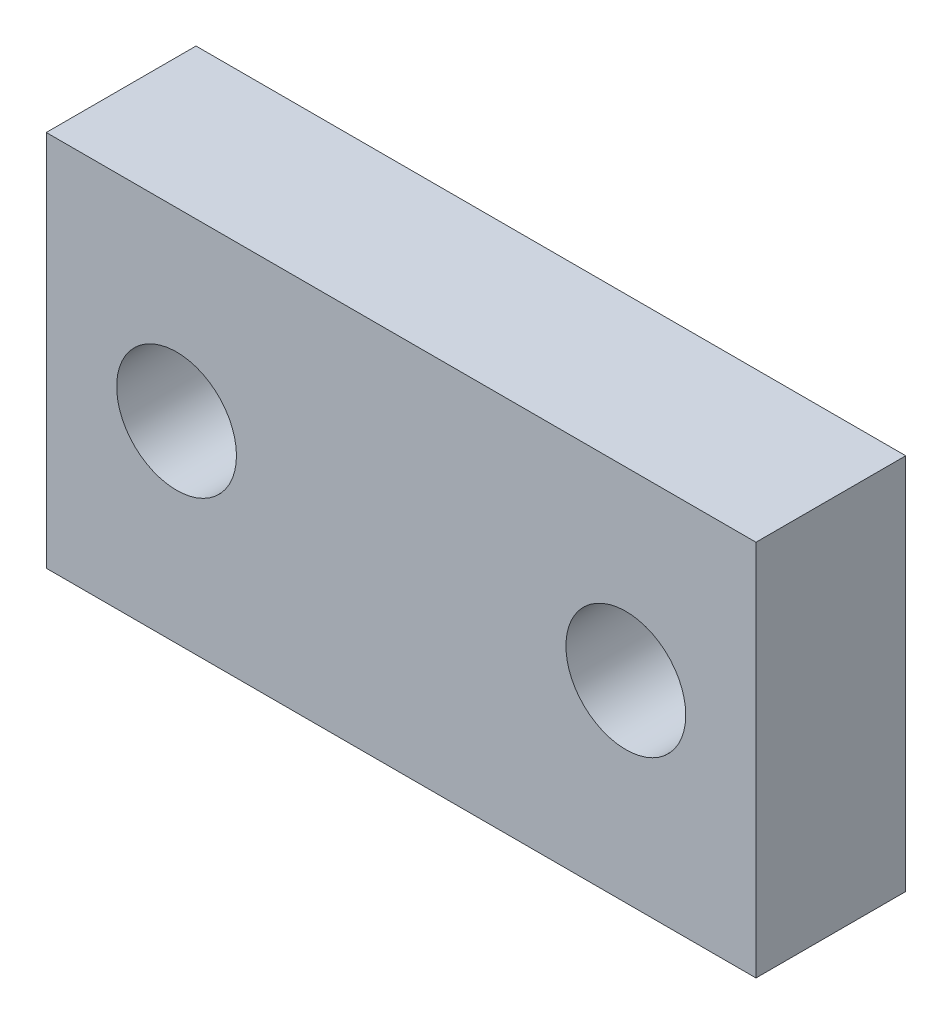
ISO-10303-21;
HEADER;
FILE_DESCRIPTION(('STEP AP214'),'2;1');
FILE_NAME('part.step','',(''),(''),'','','');
FILE_SCHEMA(('AUTOMOTIVE_DESIGN { 1 0 10303 214 1 1 1 1 }'));
ENDSEC;
DATA;
#1=APPLICATION_CONTEXT('core data for automotive mechanical design processes');
#2=APPLICATION_PROTOCOL_DEFINITION('international standard','automotive_design',2000,#1);
#3=PRODUCT_CONTEXT('',#1,'mechanical');
#4=PRODUCT('Part','Part','',(#3));
#5=PRODUCT_RELATED_PRODUCT_CATEGORY('part','',(#4));
#6=PRODUCT_DEFINITION_FORMATION('','',#4);
#7=PRODUCT_DEFINITION_CONTEXT('part definition',#1,'design');
#8=PRODUCT_DEFINITION('design','',#6,#7);
#9=PRODUCT_DEFINITION_SHAPE('','',#8);
#10=(LENGTH_UNIT() NAMED_UNIT(*) SI_UNIT(.MILLI.,.METRE.));
#11=(NAMED_UNIT(*) PLANE_ANGLE_UNIT() SI_UNIT($,.RADIAN.));
#12=(NAMED_UNIT(*) SI_UNIT($,.STERADIAN.) SOLID_ANGLE_UNIT());
#13=UNCERTAINTY_MEASURE_WITH_UNIT(LENGTH_MEASURE(1.E-05),#10,'distance_accuracy_value','');
#14=(GEOMETRIC_REPRESENTATION_CONTEXT(3) GLOBAL_UNCERTAINTY_ASSIGNED_CONTEXT((#13)) GLOBAL_UNIT_ASSIGNED_CONTEXT((#10,
#11,#12)) REPRESENTATION_CONTEXT('',''));
#15=CARTESIAN_POINT('',(0.,0.,0.));
#16=DIRECTION('',(0.,0.,1.));
#17=DIRECTION('',(1.,0.,0.));
#18=AXIS2_PLACEMENT_3D('',#15,#16,#17);
#19=CARTESIAN_POINT('',(0.,0.,5.));
#20=DIRECTION('',(0.,0.,-1.));
#21=DIRECTION('',(-1.,0.,0.));
#22=AXIS2_PLACEMENT_3D('',#19,#20,#21);
#23=PLANE('',#22);
#24=DIRECTION('',(1.,0.,0.));
#25=VECTOR('',#24,1.);
#26=CARTESIAN_POINT('',(-17.839729087058,5.99595443833464,5.));
#27=LINE('',#26,#25);
#28=CARTESIAN_POINT('',(-17.839729087058,5.99595443833464,5.));
#29=VERTEX_POINT('',#28);
#30=CARTESIAN_POINT('',(5.85553092793795,5.99595443833464,5.));
#31=VERTEX_POINT('',#30);
#32=EDGE_CURVE('E85',#29,#31,#27,.T.);
#33=ORIENTED_EDGE('',*,*,#32,.T.);
#34=DIRECTION('',(0.,1.,0.));
#35=VECTOR('',#34,1.);
#36=CARTESIAN_POINT('',(5.85553092793795,18.5959544383347,5.));
#37=LINE('',#36,#35);
#38=CARTESIAN_POINT('',(5.85553092793795,18.5959544383347,5.));
#39=VERTEX_POINT('',#38);
#40=EDGE_CURVE('E80',#31,#39,#37,.T.);
#41=ORIENTED_EDGE('',*,*,#40,.T.);
#42=DIRECTION('',(-1.,0.,0.));
#43=VECTOR('',#42,1.);
#44=CARTESIAN_POINT('',(-17.839729087058,18.5959544383347,5.));
#45=LINE('',#44,#43);
#46=CARTESIAN_POINT('',(-17.839729087058,18.5959544383347,5.));
#47=VERTEX_POINT('',#46);
#48=EDGE_CURVE('E83',#39,#47,#45,.T.);
#49=ORIENTED_EDGE('',*,*,#48,.T.);
#50=DIRECTION('',(0.,-1.,0.));
#51=VECTOR('',#50,1.);
#52=CARTESIAN_POINT('',(-17.839729087058,18.5959544383347,5.));
#53=LINE('',#52,#51);
#54=EDGE_CURVE('E50',#47,#29,#53,.T.);
#55=ORIENTED_EDGE('',*,*,#54,.T.);
#56=EDGE_LOOP('',(#33,#41,#49,#55));
#57=FACE_BOUND('',#56,.T.);
#58=CARTESIAN_POINT('',(-13.489729087058,12.4259851153314,5.));
#59=DIRECTION('',(0.,0.,1.));
#60=DIRECTION('',(1.,0.,0.));
#61=AXIS2_PLACEMENT_3D('',#58,#59,#60);
#62=CIRCLE('',#61,2.);
#63=CARTESIAN_POINT('',(-11.4897290870579,12.4259851153314,5.));
#64=VERTEX_POINT('',#63);
#65=EDGE_CURVE('E100',#64,#64,#62,.T.);
#66=ORIENTED_EDGE('',*,*,#65,.F.);
#67=EDGE_LOOP('',(#66));
#68=FACE_BOUND('',#67,.T.);
#69=CARTESIAN_POINT('',(1.51027091294206,12.4259851153314,5.));
#70=DIRECTION('',(0.,0.,1.));
#71=DIRECTION('',(1.,0.,0.));
#72=AXIS2_PLACEMENT_3D('',#69,#70,#71);
#73=CIRCLE('',#72,2.);
#74=CARTESIAN_POINT('',(3.51027091294206,12.4259851153314,5.));
#75=VERTEX_POINT('',#74);
#76=EDGE_CURVE('E115',#75,#75,#73,.T.);
#77=ORIENTED_EDGE('',*,*,#76,.F.);
#78=EDGE_LOOP('',(#77));
#79=FACE_BOUND('',#78,.T.);
#80=ADVANCED_FACE('F33',(#57,#68,#79),#23,.F.);
#81=CARTESIAN_POINT('',(0.,0.,0.));
#82=DIRECTION('',(0.,0.,-1.));
#83=DIRECTION('',(-1.,0.,0.));
#84=AXIS2_PLACEMENT_3D('',#81,#82,#83);
#85=PLANE('',#84);
#86=CARTESIAN_POINT('',(-13.489729087058,12.4259851153314,0.));
#87=DIRECTION('',(0.,0.,1.));
#88=DIRECTION('',(1.,0.,0.));
#89=AXIS2_PLACEMENT_3D('',#86,#87,#88);
#90=CIRCLE('',#89,2.);
#91=CARTESIAN_POINT('',(-11.4897290870579,12.4259851153314,0.));
#92=VERTEX_POINT('',#91);
#93=EDGE_CURVE('E112',#92,#92,#90,.T.);
#94=ORIENTED_EDGE('',*,*,#93,.T.);
#95=EDGE_LOOP('',(#94));
#96=FACE_BOUND('',#95,.T.);
#97=DIRECTION('',(1.,0.,0.));
#98=VECTOR('',#97,1.);
#99=CARTESIAN_POINT('',(-17.839729087058,5.99595443833464,0.));
#100=LINE('',#99,#98);
#101=CARTESIAN_POINT('',(-17.839729087058,5.99595443833464,0.));
#102=VERTEX_POINT('',#101);
#103=CARTESIAN_POINT('',(5.85553092793795,5.99595443833464,0.));
#104=VERTEX_POINT('',#103);
#105=EDGE_CURVE('E97',#102,#104,#100,.T.);
#106=ORIENTED_EDGE('',*,*,#105,.F.);
#107=DIRECTION('',(0.,-1.,0.));
#108=VECTOR('',#107,1.);
#109=CARTESIAN_POINT('',(-17.839729087058,18.5959544383347,0.));
#110=LINE('',#109,#108);
#111=CARTESIAN_POINT('',(-17.839729087058,18.5959544383347,0.));
#112=VERTEX_POINT('',#111);
#113=EDGE_CURVE('E73',#112,#102,#110,.T.);
#114=ORIENTED_EDGE('',*,*,#113,.F.);
#115=DIRECTION('',(-1.,0.,0.));
#116=VECTOR('',#115,1.);
#117=CARTESIAN_POINT('',(-17.839729087058,18.5959544383347,0.));
#118=LINE('',#117,#116);
#119=CARTESIAN_POINT('',(5.85553092793795,18.5959544383347,0.));
#120=VERTEX_POINT('',#119);
#121=EDGE_CURVE('E67',#120,#112,#118,.T.);
#122=ORIENTED_EDGE('',*,*,#121,.F.);
#123=DIRECTION('',(0.,1.,0.));
#124=VECTOR('',#123,1.);
#125=CARTESIAN_POINT('',(5.85553092793795,18.5959544383347,0.));
#126=LINE('',#125,#124);
#127=EDGE_CURVE('E89',#104,#120,#126,.T.);
#128=ORIENTED_EDGE('',*,*,#127,.F.);
#129=EDGE_LOOP('',(#106,#114,#122,#128));
#130=FACE_BOUND('',#129,.T.);
#131=CARTESIAN_POINT('',(1.51027091294206,12.4259851153314,0.));
#132=DIRECTION('',(0.,0.,1.));
#133=DIRECTION('',(1.,0.,0.));
#134=AXIS2_PLACEMENT_3D('',#131,#132,#133);
#135=CIRCLE('',#134,2.);
#136=CARTESIAN_POINT('',(3.51027091294206,12.4259851153314,0.));
#137=VERTEX_POINT('',#136);
#138=EDGE_CURVE('E118',#137,#137,#135,.T.);
#139=ORIENTED_EDGE('',*,*,#138,.T.);
#140=EDGE_LOOP('',(#139));
#141=FACE_BOUND('',#140,.T.);
#142=ADVANCED_FACE('F108',(#96,#130,#141),#85,.T.);
#143=CARTESIAN_POINT('',(-17.839729087058,5.99595443833464,5.));
#144=DIRECTION('',(0.,1.,0.));
#145=DIRECTION('',(0.,0.,1.));
#146=AXIS2_PLACEMENT_3D('',#143,#144,#145);
#147=PLANE('',#146);
#148=ORIENTED_EDGE('',*,*,#105,.T.);
#149=DIRECTION('',(0.,0.,-1.));
#150=VECTOR('',#149,1.);
#151=CARTESIAN_POINT('',(5.85553092793795,5.99595443833464,5.));
#152=LINE('',#151,#150);
#153=EDGE_CURVE('E11',#31,#104,#152,.T.);
#154=ORIENTED_EDGE('',*,*,#153,.F.);
#155=ORIENTED_EDGE('',*,*,#32,.F.);
#156=DIRECTION('',(0.,0.,-1.));
#157=VECTOR('',#156,1.);
#158=CARTESIAN_POINT('',(-17.839729087058,5.99595443833464,5.));
#159=LINE('',#158,#157);
#160=EDGE_CURVE('E93',#29,#102,#159,.T.);
#161=ORIENTED_EDGE('',*,*,#160,.T.);
#162=EDGE_LOOP('',(#148,#154,#155,#161));
#163=FACE_BOUND('',#162,.T.);
#164=ADVANCED_FACE('F35',(#163),#147,.F.);
#165=CARTESIAN_POINT('',(5.85553092793795,18.5959544383347,5.));
#166=DIRECTION('',(-1.,0.,0.));
#167=DIRECTION('',(0.,0.,1.));
#168=AXIS2_PLACEMENT_3D('',#165,#166,#167);
#169=PLANE('',#168);
#170=ORIENTED_EDGE('',*,*,#127,.T.);
#171=DIRECTION('',(0.,0.,-1.));
#172=VECTOR('',#171,1.);
#173=CARTESIAN_POINT('',(5.85553092793795,18.5959544383347,5.));
#174=LINE('',#173,#172);
#175=EDGE_CURVE('E42',#39,#120,#174,.T.);
#176=ORIENTED_EDGE('',*,*,#175,.F.);
#177=ORIENTED_EDGE('',*,*,#40,.F.);
#178=ORIENTED_EDGE('',*,*,#153,.T.);
#179=EDGE_LOOP('',(#170,#176,#177,#178));
#180=FACE_BOUND('',#179,.T.);
#181=ADVANCED_FACE('F88',(#180),#169,.F.);
#182=CARTESIAN_POINT('',(-17.839729087058,18.5959544383347,5.));
#183=DIRECTION('',(0.,-1.,0.));
#184=DIRECTION('',(0.,0.,-1.));
#185=AXIS2_PLACEMENT_3D('',#182,#183,#184);
#186=PLANE('',#185);
#187=ORIENTED_EDGE('',*,*,#121,.T.);
#188=DIRECTION('',(0.,0.,-1.));
#189=VECTOR('',#188,1.);
#190=CARTESIAN_POINT('',(-17.839729087058,18.5959544383347,5.));
#191=LINE('',#190,#189);
#192=EDGE_CURVE('E90',#47,#112,#191,.T.);
#193=ORIENTED_EDGE('',*,*,#192,.F.);
#194=ORIENTED_EDGE('',*,*,#48,.F.);
#195=ORIENTED_EDGE('',*,*,#175,.T.);
#196=EDGE_LOOP('',(#187,#193,#194,#195));
#197=FACE_BOUND('',#196,.T.);
#198=ADVANCED_FACE('F91',(#197),#186,.F.);
#199=CARTESIAN_POINT('',(-17.839729087058,18.5959544383347,5.));
#200=DIRECTION('',(1.,0.,0.));
#201=DIRECTION('',(0.,0.,-1.));
#202=AXIS2_PLACEMENT_3D('',#199,#200,#201);
#203=PLANE('',#202);
#204=ORIENTED_EDGE('',*,*,#113,.T.);
#205=ORIENTED_EDGE('',*,*,#160,.F.);
#206=ORIENTED_EDGE('',*,*,#54,.F.);
#207=ORIENTED_EDGE('',*,*,#192,.T.);
#208=EDGE_LOOP('',(#204,#205,#206,#207));
#209=FACE_BOUND('',#208,.T.);
#210=ADVANCED_FACE('F105',(#209),#203,.F.);
#211=CARTESIAN_POINT('',(-13.489729087058,12.4259851153314,5.));
#212=DIRECTION('',(0.,0.,-1.));
#213=DIRECTION('',(-1.,0.,0.));
#214=AXIS2_PLACEMENT_3D('',#211,#212,#213);
#215=CYLINDRICAL_SURFACE('',#214,2.);
#216=ORIENTED_EDGE('',*,*,#65,.T.);
#217=EDGE_LOOP('',(#216));
#218=FACE_BOUND('',#217,.T.);
#219=ORIENTED_EDGE('',*,*,#93,.F.);
#220=EDGE_LOOP('',(#219));
#221=FACE_BOUND('',#220,.T.);
#222=ADVANCED_FACE('F135',(#218,#221),#215,.F.);
#223=CARTESIAN_POINT('',(1.51027091294206,12.4259851153314,5.));
#224=DIRECTION('',(0.,0.,-1.));
#225=DIRECTION('',(-1.,0.,0.));
#226=AXIS2_PLACEMENT_3D('',#223,#224,#225);
#227=CYLINDRICAL_SURFACE('',#226,2.);
#228=ORIENTED_EDGE('',*,*,#76,.T.);
#229=EDGE_LOOP('',(#228));
#230=FACE_BOUND('',#229,.T.);
#231=ORIENTED_EDGE('',*,*,#138,.F.);
#232=EDGE_LOOP('',(#231));
#233=FACE_BOUND('',#232,.T.);
#234=ADVANCED_FACE('F124',(#230,#233),#227,.F.);
#235=CLOSED_SHELL('',(#80,#142,#164,#181,#198,#210,#222,#234));
#236=MANIFOLD_SOLID_BREP('B2',#235);
#237=ADVANCED_BREP_SHAPE_REPRESENTATION('',(#18,#236),#14);
#238=SHAPE_DEFINITION_REPRESENTATION(#9,#237);
ENDSEC;
END-ISO-10303-21;
